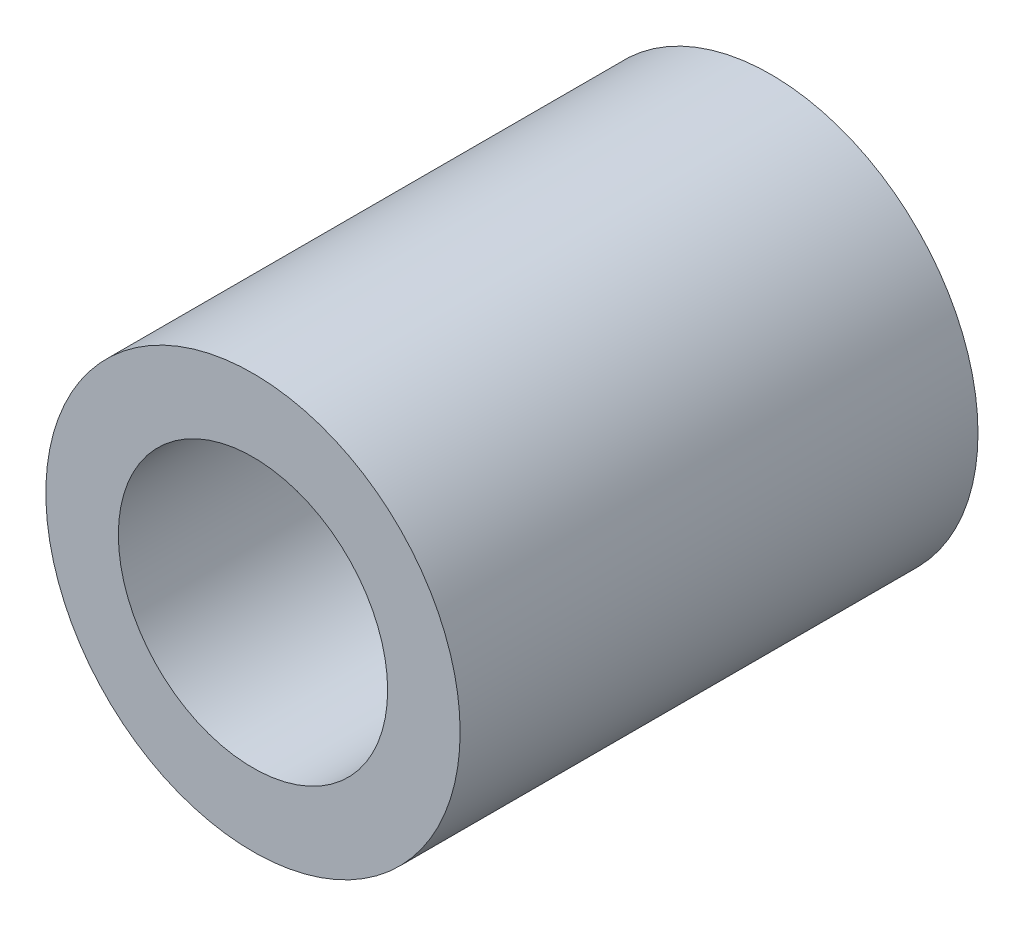
ISO-10303-21;
HEADER;
FILE_DESCRIPTION(('STEP AP214'),'2;1');
FILE_NAME('part.step','',(''),(''),'','','');
FILE_SCHEMA(('AUTOMOTIVE_DESIGN { 1 0 10303 214 1 1 1 1 }'));
ENDSEC;
DATA;
#1=APPLICATION_CONTEXT('core data for automotive mechanical design processes');
#2=APPLICATION_PROTOCOL_DEFINITION('international standard','automotive_design',2000,#1);
#3=PRODUCT_CONTEXT('',#1,'mechanical');
#4=PRODUCT('Part','Part','',(#3));
#5=PRODUCT_RELATED_PRODUCT_CATEGORY('part','',(#4));
#6=PRODUCT_DEFINITION_FORMATION('','',#4);
#7=PRODUCT_DEFINITION_CONTEXT('part definition',#1,'design');
#8=PRODUCT_DEFINITION('design','',#6,#7);
#9=PRODUCT_DEFINITION_SHAPE('','',#8);
#10=(LENGTH_UNIT() NAMED_UNIT(*) SI_UNIT(.MILLI.,.METRE.));
#11=(NAMED_UNIT(*) PLANE_ANGLE_UNIT() SI_UNIT($,.RADIAN.));
#12=(NAMED_UNIT(*) SI_UNIT($,.STERADIAN.) SOLID_ANGLE_UNIT());
#13=UNCERTAINTY_MEASURE_WITH_UNIT(LENGTH_MEASURE(1.E-05),#10,'distance_accuracy_value','');
#14=(GEOMETRIC_REPRESENTATION_CONTEXT(3) GLOBAL_UNCERTAINTY_ASSIGNED_CONTEXT((#13)) GLOBAL_UNIT_ASSIGNED_CONTEXT((#10,
#11,#12)) REPRESENTATION_CONTEXT('',''));
#15=CARTESIAN_POINT('',(0.,0.,0.));
#16=DIRECTION('',(0.,0.,1.));
#17=DIRECTION('',(1.,0.,0.));
#18=AXIS2_PLACEMENT_3D('',#15,#16,#17);
#19=CARTESIAN_POINT('',(0.,0.,-5.));
#20=DIRECTION('',(0.,0.,1.));
#21=DIRECTION('',(1.,0.,0.));
#22=AXIS2_PLACEMENT_3D('',#19,#20,#21);
#23=CYLINDRICAL_SURFACE('',#22,2.);
#24=CARTESIAN_POINT('',(0.,0.,-5.));
#25=DIRECTION('',(0.,0.,1.));
#26=DIRECTION('',(1.,0.,0.));
#27=AXIS2_PLACEMENT_3D('',#24,#25,#26);
#28=CIRCLE('',#27,2.);
#29=CARTESIAN_POINT('',(2.,0.,-5.));
#30=VERTEX_POINT('',#29);
#31=EDGE_CURVE('E10',#30,#30,#28,.T.);
#32=ORIENTED_EDGE('',*,*,#31,.T.);
#33=EDGE_LOOP('',(#32));
#34=FACE_BOUND('',#33,.T.);
#35=CARTESIAN_POINT('',(0.,0.,0.));
#36=DIRECTION('',(0.,0.,1.));
#37=DIRECTION('',(1.,0.,0.));
#38=AXIS2_PLACEMENT_3D('',#35,#36,#37);
#39=CIRCLE('',#38,2.);
#40=CARTESIAN_POINT('',(2.,0.,0.));
#41=VERTEX_POINT('',#40);
#42=EDGE_CURVE('E34',#41,#41,#39,.T.);
#43=ORIENTED_EDGE('',*,*,#42,.F.);
#44=EDGE_LOOP('',(#43));
#45=FACE_BOUND('',#44,.T.);
#46=ADVANCED_FACE('F31',(#34,#45),#23,.T.);
#47=CARTESIAN_POINT('',(0.,0.,-5.));
#48=DIRECTION('',(0.,0.,1.));
#49=DIRECTION('',(1.,0.,0.));
#50=AXIS2_PLACEMENT_3D('',#47,#48,#49);
#51=PLANE('',#50);
#52=CARTESIAN_POINT('',(0.,0.,-5.));
#53=DIRECTION('',(0.,0.,1.));
#54=DIRECTION('',(1.,0.,0.));
#55=AXIS2_PLACEMENT_3D('',#52,#53,#54);
#56=CIRCLE('',#55,1.3);
#57=CARTESIAN_POINT('',(1.3,0.,-5.));
#58=VERTEX_POINT('',#57);
#59=EDGE_CURVE('E41',#58,#58,#56,.T.);
#60=ORIENTED_EDGE('',*,*,#59,.T.);
#61=EDGE_LOOP('',(#60));
#62=FACE_BOUND('',#61,.T.);
#63=ORIENTED_EDGE('',*,*,#31,.F.);
#64=EDGE_LOOP('',(#63));
#65=FACE_BOUND('',#64,.T.);
#66=ADVANCED_FACE('F49',(#62,#65),#51,.F.);
#67=CARTESIAN_POINT('',(0.,0.,0.));
#68=DIRECTION('',(0.,0.,1.));
#69=DIRECTION('',(1.,0.,0.));
#70=AXIS2_PLACEMENT_3D('',#67,#68,#69);
#71=PLANE('',#70);
#72=CARTESIAN_POINT('',(0.,0.,0.));
#73=DIRECTION('',(0.,0.,1.));
#74=DIRECTION('',(1.,0.,0.));
#75=AXIS2_PLACEMENT_3D('',#72,#73,#74);
#76=CIRCLE('',#75,1.3);
#77=CARTESIAN_POINT('',(1.3,0.,0.));
#78=VERTEX_POINT('',#77);
#79=EDGE_CURVE('E43',#78,#78,#76,.T.);
#80=ORIENTED_EDGE('',*,*,#79,.F.);
#81=EDGE_LOOP('',(#80));
#82=FACE_BOUND('',#81,.T.);
#83=ORIENTED_EDGE('',*,*,#42,.T.);
#84=EDGE_LOOP('',(#83));
#85=FACE_BOUND('',#84,.T.);
#86=ADVANCED_FACE('F55',(#82,#85),#71,.T.);
#87=CARTESIAN_POINT('',(0.,0.,-5.));
#88=DIRECTION('',(0.,0.,1.));
#89=DIRECTION('',(1.,0.,0.));
#90=AXIS2_PLACEMENT_3D('',#87,#88,#89);
#91=CYLINDRICAL_SURFACE('',#90,1.3);
#92=ORIENTED_EDGE('',*,*,#59,.F.);
#93=EDGE_LOOP('',(#92));
#94=FACE_BOUND('',#93,.T.);
#95=ORIENTED_EDGE('',*,*,#79,.T.);
#96=EDGE_LOOP('',(#95));
#97=FACE_BOUND('',#96,.T.);
#98=ADVANCED_FACE('F52',(#94,#97),#91,.F.);
#99=CLOSED_SHELL('',(#46,#66,#86,#98));
#100=MANIFOLD_SOLID_BREP('B2',#99);
#101=ADVANCED_BREP_SHAPE_REPRESENTATION('',(#18,#100),#14);
#102=SHAPE_DEFINITION_REPRESENTATION(#9,#101);
ENDSEC;
END-ISO-10303-21;
